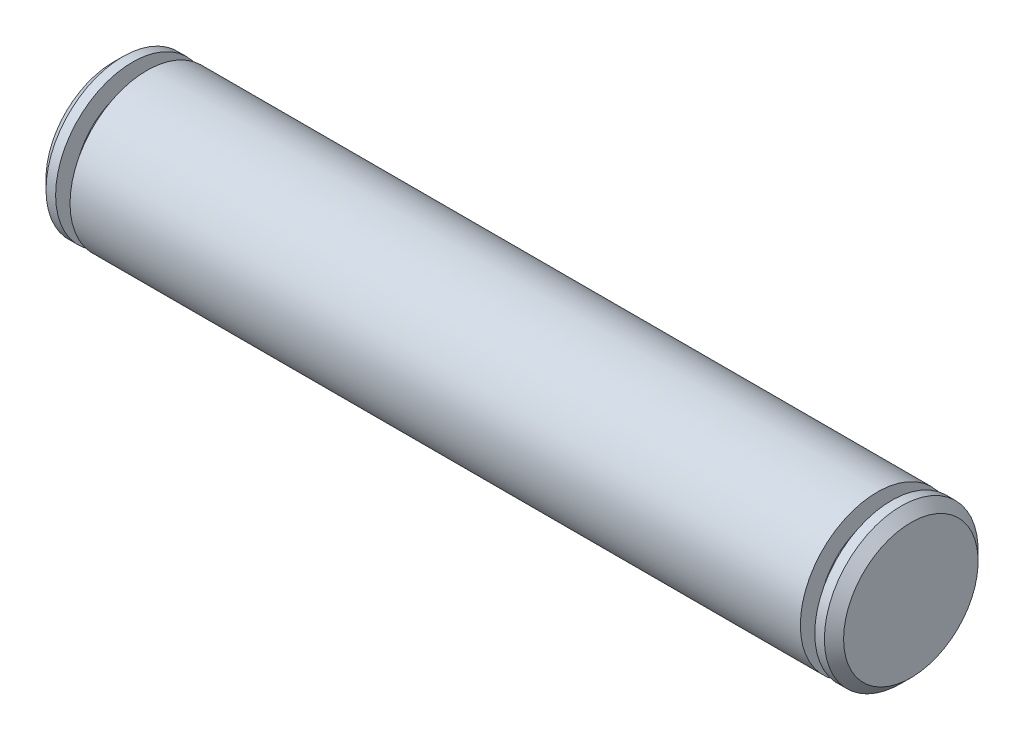
ISO-10303-21;
HEADER;
FILE_DESCRIPTION(('STEP AP214'),'2;1');
FILE_NAME('part.step','',(''),(''),'','','');
FILE_SCHEMA(('AUTOMOTIVE_DESIGN { 1 0 10303 214 1 1 1 1 }'));
ENDSEC;
DATA;
#1=APPLICATION_CONTEXT('core data for automotive mechanical design processes');
#2=APPLICATION_PROTOCOL_DEFINITION('international standard','automotive_design',2000,#1);
#3=PRODUCT_CONTEXT('',#1,'mechanical');
#4=PRODUCT('Part','Part','',(#3));
#5=PRODUCT_RELATED_PRODUCT_CATEGORY('part','',(#4));
#6=PRODUCT_DEFINITION_FORMATION('','',#4);
#7=PRODUCT_DEFINITION_CONTEXT('part definition',#1,'design');
#8=PRODUCT_DEFINITION('design','',#6,#7);
#9=PRODUCT_DEFINITION_SHAPE('','',#8);
#10=(LENGTH_UNIT() NAMED_UNIT(*) SI_UNIT(.MILLI.,.METRE.));
#11=(NAMED_UNIT(*) PLANE_ANGLE_UNIT() SI_UNIT($,.RADIAN.));
#12=(NAMED_UNIT(*) SI_UNIT($,.STERADIAN.) SOLID_ANGLE_UNIT());
#13=UNCERTAINTY_MEASURE_WITH_UNIT(LENGTH_MEASURE(1.E-05),#10,'distance_accuracy_value','');
#14=(GEOMETRIC_REPRESENTATION_CONTEXT(3) GLOBAL_UNCERTAINTY_ASSIGNED_CONTEXT((#13)) GLOBAL_UNIT_ASSIGNED_CONTEXT((#10,
#11,#12)) REPRESENTATION_CONTEXT('',''));
#15=CARTESIAN_POINT('',(0.,0.,0.));
#16=DIRECTION('',(0.,0.,1.));
#17=DIRECTION('',(1.,0.,0.));
#18=AXIS2_PLACEMENT_3D('',#15,#16,#17);
#19=CARTESIAN_POINT('',(41.5,0.,0.));
#20=DIRECTION('',(-1.,0.,0.));
#21=DIRECTION('',(0.,0.,1.));
#22=AXIS2_PLACEMENT_3D('',#19,#20,#21);
#23=PLANE('',#22);
#24=CARTESIAN_POINT('',(41.5,0.,0.));
#25=DIRECTION('',(-1.,0.,0.));
#26=DIRECTION('',(0.,0.,1.));
#27=AXIS2_PLACEMENT_3D('',#24,#25,#26);
#28=CIRCLE('',#27,6.99999999999999);
#29=CARTESIAN_POINT('',(41.5,0.,6.99999999999999));
#30=VERTEX_POINT('',#29);
#31=EDGE_CURVE('E48',#30,#30,#28,.F.);
#32=ORIENTED_EDGE('',*,*,#31,.T.);
#33=EDGE_LOOP('',(#32));
#34=FACE_BOUND('',#33,.T.);
#35=ADVANCED_FACE('F37',(#34),#23,.F.);
#36=CARTESIAN_POINT('',(-47.1519917646546,0.,0.));
#37=DIRECTION('',(-1.,0.,0.));
#38=DIRECTION('',(0.,0.,1.));
#39=AXIS2_PLACEMENT_3D('',#36,#37,#38);
#40=CYLINDRICAL_SURFACE('',#39,8.00000000000001);
#41=CARTESIAN_POINT('',(40.5,0.,0.));
#42=DIRECTION('',(-1.,0.,0.));
#43=DIRECTION('',(0.,0.,1.));
#44=AXIS2_PLACEMENT_3D('',#41,#42,#43);
#45=CIRCLE('',#44,8.00000000000001);
#46=CARTESIAN_POINT('',(40.5,0.,8.00000000000001));
#47=VERTEX_POINT('',#46);
#48=EDGE_CURVE('E52',#47,#47,#45,.T.);
#49=ORIENTED_EDGE('',*,*,#48,.T.);
#50=EDGE_LOOP('',(#49));
#51=FACE_BOUND('',#50,.T.);
#52=CARTESIAN_POINT('',(39.5,0.,0.));
#53=DIRECTION('',(-1.,0.,0.));
#54=DIRECTION('',(0.,0.,1.));
#55=AXIS2_PLACEMENT_3D('',#52,#53,#54);
#56=CIRCLE('',#55,8.00000000000001);
#57=CARTESIAN_POINT('',(39.5,0.,8.00000000000001));
#58=VERTEX_POINT('',#57);
#59=EDGE_CURVE('E57',#58,#58,#56,.T.);
#60=ORIENTED_EDGE('',*,*,#59,.F.);
#61=EDGE_LOOP('',(#60));
#62=FACE_BOUND('',#61,.T.);
#63=ADVANCED_FACE('F123',(#51,#62),#40,.T.);
#64=CARTESIAN_POINT('',(39.5,8.00000000000001,0.));
#65=DIRECTION('',(1.,0.,0.));
#66=DIRECTION('',(0.,0.,-1.));
#67=AXIS2_PLACEMENT_3D('',#64,#65,#66);
#68=PLANE('',#67);
#69=CARTESIAN_POINT('',(39.5,0.,0.));
#70=DIRECTION('',(-1.,0.,0.));
#71=DIRECTION('',(0.,0.,1.));
#72=AXIS2_PLACEMENT_3D('',#69,#70,#71);
#73=CIRCLE('',#72,6.00000000000001);
#74=CARTESIAN_POINT('',(39.5,0.,6.00000000000001));
#75=VERTEX_POINT('',#74);
#76=EDGE_CURVE('E60',#75,#75,#73,.T.);
#77=ORIENTED_EDGE('',*,*,#76,.F.);
#78=EDGE_LOOP('',(#77));
#79=FACE_BOUND('',#78,.T.);
#80=ORIENTED_EDGE('',*,*,#59,.T.);
#81=EDGE_LOOP('',(#80));
#82=FACE_BOUND('',#81,.T.);
#83=ADVANCED_FACE('F117',(#79,#82),#68,.F.);
#84=CARTESIAN_POINT('',(-47.1519917646546,0.,0.));
#85=DIRECTION('',(-1.,0.,0.));
#86=DIRECTION('',(0.,0.,1.));
#87=AXIS2_PLACEMENT_3D('',#84,#85,#86);
#88=CYLINDRICAL_SURFACE('',#87,6.00000000000001);
#89=CARTESIAN_POINT('',(38.,0.,0.));
#90=DIRECTION('',(-1.,0.,0.));
#91=DIRECTION('',(0.,0.,1.));
#92=AXIS2_PLACEMENT_3D('',#89,#90,#91);
#93=CIRCLE('',#92,6.00000000000001);
#94=CARTESIAN_POINT('',(38.,0.,6.00000000000001));
#95=VERTEX_POINT('',#94);
#96=EDGE_CURVE('E63',#95,#95,#93,.T.);
#97=ORIENTED_EDGE('',*,*,#96,.F.);
#98=EDGE_LOOP('',(#97));
#99=FACE_BOUND('',#98,.T.);
#100=ORIENTED_EDGE('',*,*,#76,.T.);
#101=EDGE_LOOP('',(#100));
#102=FACE_BOUND('',#101,.T.);
#103=ADVANCED_FACE('F111',(#99,#102),#88,.T.);
#104=CARTESIAN_POINT('',(38.,6.00000000000001,0.));
#105=DIRECTION('',(-1.,0.,0.));
#106=DIRECTION('',(0.,0.,1.));
#107=AXIS2_PLACEMENT_3D('',#104,#105,#106);
#108=PLANE('',#107);
#109=CARTESIAN_POINT('',(38.,0.,0.));
#110=DIRECTION('',(-1.,0.,0.));
#111=DIRECTION('',(0.,0.,1.));
#112=AXIS2_PLACEMENT_3D('',#109,#110,#111);
#113=CIRCLE('',#112,8.);
#114=CARTESIAN_POINT('',(38.,0.,8.));
#115=VERTEX_POINT('',#114);
#116=EDGE_CURVE('E66',#115,#115,#113,.T.);
#117=ORIENTED_EDGE('',*,*,#116,.F.);
#118=EDGE_LOOP('',(#117));
#119=FACE_BOUND('',#118,.T.);
#120=ORIENTED_EDGE('',*,*,#96,.T.);
#121=EDGE_LOOP('',(#120));
#122=FACE_BOUND('',#121,.T.);
#123=ADVANCED_FACE('F105',(#119,#122),#108,.F.);
#124=CARTESIAN_POINT('',(-47.1519917646546,0.,0.));
#125=DIRECTION('',(-1.,0.,0.));
#126=DIRECTION('',(0.,0.,1.));
#127=AXIS2_PLACEMENT_3D('',#124,#125,#126);
#128=CYLINDRICAL_SURFACE('',#127,8.);
#129=CARTESIAN_POINT('',(-38.,0.,0.));
#130=DIRECTION('',(-1.,0.,0.));
#131=DIRECTION('',(0.,0.,1.));
#132=AXIS2_PLACEMENT_3D('',#129,#130,#131);
#133=CIRCLE('',#132,8.);
#134=CARTESIAN_POINT('',(-38.,0.,8.));
#135=VERTEX_POINT('',#134);
#136=EDGE_CURVE('E69',#135,#135,#133,.T.);
#137=ORIENTED_EDGE('',*,*,#136,.F.);
#138=EDGE_LOOP('',(#137));
#139=FACE_BOUND('',#138,.T.);
#140=ORIENTED_EDGE('',*,*,#116,.T.);
#141=EDGE_LOOP('',(#140));
#142=FACE_BOUND('',#141,.T.);
#143=ADVANCED_FACE('F99',(#139,#142),#128,.T.);
#144=CARTESIAN_POINT('',(-38.,6.,0.));
#145=DIRECTION('',(1.,0.,0.));
#146=DIRECTION('',(0.,0.,-1.));
#147=AXIS2_PLACEMENT_3D('',#144,#145,#146);
#148=PLANE('',#147);
#149=CARTESIAN_POINT('',(-38.,0.,0.));
#150=DIRECTION('',(-1.,0.,0.));
#151=DIRECTION('',(0.,0.,1.));
#152=AXIS2_PLACEMENT_3D('',#149,#150,#151);
#153=CIRCLE('',#152,6.);
#154=CARTESIAN_POINT('',(-38.,0.,6.));
#155=VERTEX_POINT('',#154);
#156=EDGE_CURVE('E72',#155,#155,#153,.T.);
#157=ORIENTED_EDGE('',*,*,#156,.F.);
#158=EDGE_LOOP('',(#157));
#159=FACE_BOUND('',#158,.T.);
#160=ORIENTED_EDGE('',*,*,#136,.T.);
#161=EDGE_LOOP('',(#160));
#162=FACE_BOUND('',#161,.T.);
#163=ADVANCED_FACE('F93',(#159,#162),#148,.F.);
#164=CARTESIAN_POINT('',(-47.1519917646546,0.,0.));
#165=DIRECTION('',(-1.,0.,0.));
#166=DIRECTION('',(0.,0.,1.));
#167=AXIS2_PLACEMENT_3D('',#164,#165,#166);
#168=CYLINDRICAL_SURFACE('',#167,6.);
#169=CARTESIAN_POINT('',(-39.5,0.,0.));
#170=DIRECTION('',(-1.,0.,0.));
#171=DIRECTION('',(0.,0.,1.));
#172=AXIS2_PLACEMENT_3D('',#169,#170,#171);
#173=CIRCLE('',#172,6.);
#174=CARTESIAN_POINT('',(-39.5,0.,6.));
#175=VERTEX_POINT('',#174);
#176=EDGE_CURVE('E75',#175,#175,#173,.T.);
#177=ORIENTED_EDGE('',*,*,#176,.F.);
#178=EDGE_LOOP('',(#177));
#179=FACE_BOUND('',#178,.T.);
#180=ORIENTED_EDGE('',*,*,#156,.T.);
#181=EDGE_LOOP('',(#180));
#182=FACE_BOUND('',#181,.T.);
#183=ADVANCED_FACE('F87',(#179,#182),#168,.T.);
#184=CARTESIAN_POINT('',(-39.5,8.,0.));
#185=DIRECTION('',(-1.,0.,0.));
#186=DIRECTION('',(0.,0.,1.));
#187=AXIS2_PLACEMENT_3D('',#184,#185,#186);
#188=PLANE('',#187);
#189=CARTESIAN_POINT('',(-39.5,0.,0.));
#190=DIRECTION('',(-1.,0.,0.));
#191=DIRECTION('',(0.,0.,1.));
#192=AXIS2_PLACEMENT_3D('',#189,#190,#191);
#193=CIRCLE('',#192,8.);
#194=CARTESIAN_POINT('',(-39.5,0.,8.));
#195=VERTEX_POINT('',#194);
#196=EDGE_CURVE('E78',#195,#195,#193,.T.);
#197=ORIENTED_EDGE('',*,*,#196,.F.);
#198=EDGE_LOOP('',(#197));
#199=FACE_BOUND('',#198,.T.);
#200=ORIENTED_EDGE('',*,*,#176,.T.);
#201=EDGE_LOOP('',(#200));
#202=FACE_BOUND('',#201,.T.);
#203=ADVANCED_FACE('F84',(#199,#202),#188,.F.);
#204=CARTESIAN_POINT('',(-47.1519917646546,0.,0.));
#205=DIRECTION('',(-1.,0.,0.));
#206=DIRECTION('',(0.,0.,1.));
#207=AXIS2_PLACEMENT_3D('',#204,#205,#206);
#208=CYLINDRICAL_SURFACE('',#207,8.);
#209=CARTESIAN_POINT('',(-40.5,0.,0.));
#210=DIRECTION('',(1.,0.,0.));
#211=DIRECTION('',(0.,0.,-1.));
#212=AXIS2_PLACEMENT_3D('',#209,#210,#211);
#213=CIRCLE('',#212,8.);
#214=CARTESIAN_POINT('',(-40.5,0.,-8.));
#215=VERTEX_POINT('',#214);
#216=EDGE_CURVE('E10',#215,#215,#213,.T.);
#217=ORIENTED_EDGE('',*,*,#216,.T.);
#218=EDGE_LOOP('',(#217));
#219=FACE_BOUND('',#218,.T.);
#220=ORIENTED_EDGE('',*,*,#196,.T.);
#221=EDGE_LOOP('',(#220));
#222=FACE_BOUND('',#221,.T.);
#223=ADVANCED_FACE('F82',(#219,#222),#208,.T.);
#224=CARTESIAN_POINT('',(-41.5,0.,0.));
#225=DIRECTION('',(1.,0.,0.));
#226=DIRECTION('',(0.,0.,-1.));
#227=AXIS2_PLACEMENT_3D('',#224,#225,#226);
#228=PLANE('',#227);
#229=CARTESIAN_POINT('',(-41.5,0.,0.));
#230=DIRECTION('',(1.,0.,0.));
#231=DIRECTION('',(0.,0.,-1.));
#232=AXIS2_PLACEMENT_3D('',#229,#230,#231);
#233=CIRCLE('',#232,6.99999999999999);
#234=CARTESIAN_POINT('',(-41.5,0.,-6.99999999999999));
#235=VERTEX_POINT('',#234);
#236=EDGE_CURVE('E44',#235,#235,#233,.F.);
#237=ORIENTED_EDGE('',*,*,#236,.T.);
#238=EDGE_LOOP('',(#237));
#239=FACE_BOUND('',#238,.T.);
#240=ADVANCED_FACE('F137',(#239),#228,.F.);
#241=CARTESIAN_POINT('',(40.5,0.,0.));
#242=DIRECTION('',(-1.,0.,0.));
#243=DIRECTION('',(0.,0.,1.));
#244=AXIS2_PLACEMENT_3D('',#241,#242,#243);
#245=CONICAL_SURFACE('',#244,8.00000000000001,0.785398163397454);
#246=ORIENTED_EDGE('',*,*,#31,.F.);
#247=EDGE_LOOP('',(#246));
#248=FACE_BOUND('',#247,.T.);
#249=ORIENTED_EDGE('',*,*,#48,.F.);
#250=EDGE_LOOP('',(#249));
#251=FACE_BOUND('',#250,.T.);
#252=ADVANCED_FACE('F135',(#248,#251),#245,.T.);
#253=CARTESIAN_POINT('',(-41.5,0.,0.));
#254=DIRECTION('',(1.,0.,0.));
#255=DIRECTION('',(0.,0.,-1.));
#256=AXIS2_PLACEMENT_3D('',#253,#254,#255);
#257=CONICAL_SURFACE('',#256,6.99999999999999,0.785398163397453);
#258=ORIENTED_EDGE('',*,*,#216,.F.);
#259=EDGE_LOOP('',(#258));
#260=FACE_BOUND('',#259,.T.);
#261=ORIENTED_EDGE('',*,*,#236,.F.);
#262=EDGE_LOOP('',(#261));
#263=FACE_BOUND('',#262,.T.);
#264=ADVANCED_FACE('F39',(#260,#263),#257,.T.);
#265=CLOSED_SHELL('',(#35,#63,#83,#103,#123,#143,#163,#183,#203,#223,#240,#252,#264));
#266=MANIFOLD_SOLID_BREP('B2',#265);
#267=ADVANCED_BREP_SHAPE_REPRESENTATION('',(#18,#266),#14);
#268=SHAPE_DEFINITION_REPRESENTATION(#9,#267);
ENDSEC;
END-ISO-10303-21;
